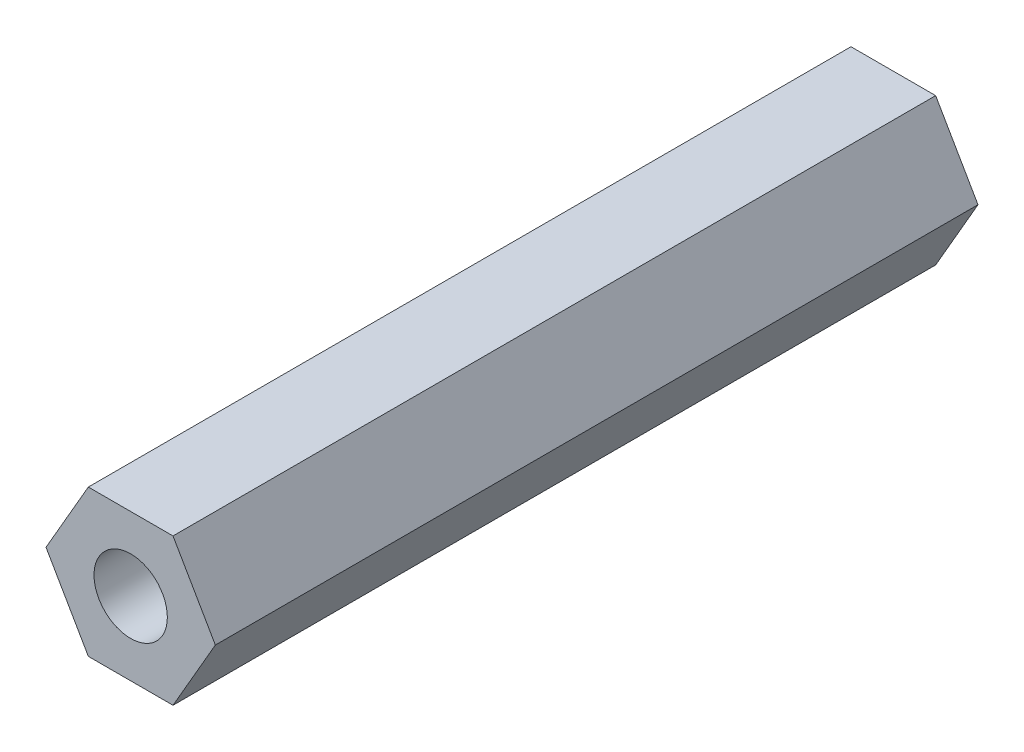
ISO-10303-21;
HEADER;
FILE_DESCRIPTION(('STEP AP214'),'2;1');
FILE_NAME('part.step','',(''),(''),'','','');
FILE_SCHEMA(('AUTOMOTIVE_DESIGN { 1 0 10303 214 1 1 1 1 }'));
ENDSEC;
DATA;
#1=APPLICATION_CONTEXT('core data for automotive mechanical design processes');
#2=APPLICATION_PROTOCOL_DEFINITION('international standard','automotive_design',2000,#1);
#3=PRODUCT_CONTEXT('',#1,'mechanical');
#4=PRODUCT('Part','Part','',(#3));
#5=PRODUCT_RELATED_PRODUCT_CATEGORY('part','',(#4));
#6=PRODUCT_DEFINITION_FORMATION('','',#4);
#7=PRODUCT_DEFINITION_CONTEXT('part definition',#1,'design');
#8=PRODUCT_DEFINITION('design','',#6,#7);
#9=PRODUCT_DEFINITION_SHAPE('','',#8);
#10=(LENGTH_UNIT() NAMED_UNIT(*) SI_UNIT(.MILLI.,.METRE.));
#11=(NAMED_UNIT(*) PLANE_ANGLE_UNIT() SI_UNIT($,.RADIAN.));
#12=(NAMED_UNIT(*) SI_UNIT($,.STERADIAN.) SOLID_ANGLE_UNIT());
#13=UNCERTAINTY_MEASURE_WITH_UNIT(LENGTH_MEASURE(1.E-05),#10,'distance_accuracy_value','');
#14=(GEOMETRIC_REPRESENTATION_CONTEXT(3) GLOBAL_UNCERTAINTY_ASSIGNED_CONTEXT((#13)) GLOBAL_UNIT_ASSIGNED_CONTEXT((#10,
#11,#12)) REPRESENTATION_CONTEXT('',''));
#15=CARTESIAN_POINT('',(0.,0.,0.));
#16=DIRECTION('',(0.,0.,1.));
#17=DIRECTION('',(1.,0.,0.));
#18=AXIS2_PLACEMENT_3D('',#15,#16,#17);
#19=CARTESIAN_POINT('',(0.,-2.5,26.));
#20=DIRECTION('',(0.,1.,0.));
#21=DIRECTION('',(-1.,0.,0.));
#22=AXIS2_PLACEMENT_3D('',#19,#20,#21);
#23=PLANE('',#22);
#24=DIRECTION('',(1.,0.,0.));
#25=VECTOR('',#24,1.);
#26=CARTESIAN_POINT('',(0.,-2.5,0.));
#27=LINE('',#26,#25);
#28=CARTESIAN_POINT('',(-1.44337567297404,-2.50000000000002,0.));
#29=VERTEX_POINT('',#28);
#30=CARTESIAN_POINT('',(1.44337567297409,-2.49999999999998,0.));
#31=VERTEX_POINT('',#30);
#32=EDGE_CURVE('E131',#29,#31,#27,.T.);
#33=ORIENTED_EDGE('',*,*,#32,.T.);
#34=DIRECTION('',(0.,0.,-1.));
#35=VECTOR('',#34,1.);
#36=CARTESIAN_POINT('',(1.44337567297409,-2.49999999999998,26.));
#37=LINE('',#36,#35);
#38=CARTESIAN_POINT('',(1.44337567297409,-2.49999999999998,26.));
#39=VERTEX_POINT('',#38);
#40=EDGE_CURVE('E11',#39,#31,#37,.T.);
#41=ORIENTED_EDGE('',*,*,#40,.F.);
#42=DIRECTION('',(1.,0.,0.));
#43=VECTOR('',#42,1.);
#44=CARTESIAN_POINT('',(0.,-2.5,26.));
#45=LINE('',#44,#43);
#46=CARTESIAN_POINT('',(-1.44337567297404,-2.50000000000002,26.));
#47=VERTEX_POINT('',#46);
#48=EDGE_CURVE('E142',#47,#39,#45,.T.);
#49=ORIENTED_EDGE('',*,*,#48,.F.);
#50=DIRECTION('',(0.,0.,-1.));
#51=VECTOR('',#50,1.);
#52=CARTESIAN_POINT('',(-1.44337567297404,-2.50000000000002,26.));
#53=LINE('',#52,#51);
#54=EDGE_CURVE('E127',#47,#29,#53,.T.);
#55=ORIENTED_EDGE('',*,*,#54,.T.);
#56=EDGE_LOOP('',(#33,#41,#49,#55));
#57=FACE_BOUND('',#56,.T.);
#58=ADVANCED_FACE('F45',(#57),#23,.F.);
#59=CARTESIAN_POINT('',(2.16506350946111,-1.24999999999999,26.));
#60=DIRECTION('',(-0.866025403784442,0.499999999999995,0.));
#61=DIRECTION('',(-0.499999999999995,-0.866025403784442,0.));
#62=AXIS2_PLACEMENT_3D('',#59,#60,#61);
#63=PLANE('',#62);
#64=DIRECTION('',(0.499999999999995,0.866025403784442,0.));
#65=VECTOR('',#64,1.);
#66=CARTESIAN_POINT('',(2.16506350946111,-1.24999999999999,0.));
#67=LINE('',#66,#65);
#68=CARTESIAN_POINT('',(2.88675134594813,0.,0.));
#69=VERTEX_POINT('',#68);
#70=EDGE_CURVE('E134',#31,#69,#67,.T.);
#71=ORIENTED_EDGE('',*,*,#70,.T.);
#72=DIRECTION('',(0.,0.,-1.));
#73=VECTOR('',#72,1.);
#74=CARTESIAN_POINT('',(2.88675134594813,0.,26.));
#75=LINE('',#74,#73);
#76=CARTESIAN_POINT('',(2.88675134594813,0.,26.));
#77=VERTEX_POINT('',#76);
#78=EDGE_CURVE('E53',#77,#69,#75,.T.);
#79=ORIENTED_EDGE('',*,*,#78,.F.);
#80=DIRECTION('',(0.499999999999995,0.866025403784442,0.));
#81=VECTOR('',#80,1.);
#82=CARTESIAN_POINT('',(2.16506350946111,-1.24999999999999,26.));
#83=LINE('',#82,#81);
#84=EDGE_CURVE('E99',#39,#77,#83,.T.);
#85=ORIENTED_EDGE('',*,*,#84,.F.);
#86=ORIENTED_EDGE('',*,*,#40,.T.);
#87=EDGE_LOOP('',(#71,#79,#85,#86));
#88=FACE_BOUND('',#87,.T.);
#89=ADVANCED_FACE('F167',(#88),#63,.F.);
#90=CARTESIAN_POINT('',(2.1650635094611,1.25,26.));
#91=DIRECTION('',(-0.866025403784438,-0.500000000000001,0.));
#92=DIRECTION('',(0.500000000000001,-0.866025403784438,0.));
#93=AXIS2_PLACEMENT_3D('',#90,#91,#92);
#94=PLANE('',#93);
#95=DIRECTION('',(-0.500000000000001,0.866025403784438,0.));
#96=VECTOR('',#95,1.);
#97=CARTESIAN_POINT('',(2.1650635094611,1.25,0.));
#98=LINE('',#97,#96);
#99=CARTESIAN_POINT('',(1.44337567297406,2.50000000000001,0.));
#100=VERTEX_POINT('',#99);
#101=EDGE_CURVE('E137',#69,#100,#98,.T.);
#102=ORIENTED_EDGE('',*,*,#101,.T.);
#103=DIRECTION('',(0.,0.,-1.));
#104=VECTOR('',#103,1.);
#105=CARTESIAN_POINT('',(1.44337567297406,2.50000000000001,26.));
#106=LINE('',#105,#104);
#107=CARTESIAN_POINT('',(1.44337567297406,2.50000000000001,26.));
#108=VERTEX_POINT('',#107);
#109=EDGE_CURVE('E122',#108,#100,#106,.T.);
#110=ORIENTED_EDGE('',*,*,#109,.F.);
#111=DIRECTION('',(-0.500000000000001,0.866025403784438,0.));
#112=VECTOR('',#111,1.);
#113=CARTESIAN_POINT('',(2.1650635094611,1.25,26.));
#114=LINE('',#113,#112);
#115=EDGE_CURVE('E113',#77,#108,#114,.T.);
#116=ORIENTED_EDGE('',*,*,#115,.F.);
#117=ORIENTED_EDGE('',*,*,#78,.T.);
#118=EDGE_LOOP('',(#102,#110,#116,#117));
#119=FACE_BOUND('',#118,.T.);
#120=ADVANCED_FACE('F148',(#119),#94,.F.);
#121=CARTESIAN_POINT('',(0.,2.5,26.));
#122=DIRECTION('',(0.,-1.,0.));
#123=DIRECTION('',(1.,0.,0.));
#124=AXIS2_PLACEMENT_3D('',#121,#122,#123);
#125=PLANE('',#124);
#126=DIRECTION('',(-1.,0.,0.));
#127=VECTOR('',#126,1.);
#128=CARTESIAN_POINT('',(0.,2.5,0.));
#129=LINE('',#128,#127);
#130=CARTESIAN_POINT('',(-1.44337567297408,2.49999999999999,0.));
#131=VERTEX_POINT('',#130);
#132=EDGE_CURVE('E121',#100,#131,#129,.T.);
#133=ORIENTED_EDGE('',*,*,#132,.T.);
#134=DIRECTION('',(0.,0.,-1.));
#135=VECTOR('',#134,1.);
#136=CARTESIAN_POINT('',(-1.44337567297408,2.49999999999999,26.));
#137=LINE('',#136,#135);
#138=CARTESIAN_POINT('',(-1.44337567297408,2.49999999999999,26.));
#139=VERTEX_POINT('',#138);
#140=EDGE_CURVE('E118',#139,#131,#137,.T.);
#141=ORIENTED_EDGE('',*,*,#140,.F.);
#142=DIRECTION('',(-1.,0.,0.));
#143=VECTOR('',#142,1.);
#144=CARTESIAN_POINT('',(0.,2.5,26.));
#145=LINE('',#144,#143);
#146=EDGE_CURVE('E107',#108,#139,#145,.T.);
#147=ORIENTED_EDGE('',*,*,#146,.F.);
#148=ORIENTED_EDGE('',*,*,#109,.T.);
#149=EDGE_LOOP('',(#133,#141,#147,#148));
#150=FACE_BOUND('',#149,.T.);
#151=ADVANCED_FACE('F119',(#150),#125,.F.);
#152=CARTESIAN_POINT('',(-2.1650635094611,1.24999999999999,26.));
#153=DIRECTION('',(0.866025403784441,-0.499999999999995,0.));
#154=DIRECTION('',(0.499999999999995,0.866025403784441,0.));
#155=AXIS2_PLACEMENT_3D('',#152,#153,#154);
#156=PLANE('',#155);
#157=DIRECTION('',(-0.499999999999995,-0.866025403784441,0.));
#158=VECTOR('',#157,1.);
#159=CARTESIAN_POINT('',(-2.1650635094611,1.24999999999999,0.));
#160=LINE('',#159,#158);
#161=CARTESIAN_POINT('',(-2.88675134594813,0.,0.));
#162=VERTEX_POINT('',#161);
#163=EDGE_CURVE('E85',#131,#162,#160,.T.);
#164=ORIENTED_EDGE('',*,*,#163,.T.);
#165=DIRECTION('',(0.,0.,-1.));
#166=VECTOR('',#165,1.);
#167=CARTESIAN_POINT('',(-2.88675134594813,0.,26.));
#168=LINE('',#167,#166);
#169=CARTESIAN_POINT('',(-2.88675134594813,0.,26.));
#170=VERTEX_POINT('',#169);
#171=EDGE_CURVE('E123',#170,#162,#168,.T.);
#172=ORIENTED_EDGE('',*,*,#171,.F.);
#173=DIRECTION('',(-0.499999999999995,-0.866025403784441,0.));
#174=VECTOR('',#173,1.);
#175=CARTESIAN_POINT('',(-2.1650635094611,1.24999999999999,26.));
#176=LINE('',#175,#174);
#177=EDGE_CURVE('E111',#139,#170,#176,.T.);
#178=ORIENTED_EDGE('',*,*,#177,.F.);
#179=ORIENTED_EDGE('',*,*,#140,.T.);
#180=EDGE_LOOP('',(#164,#172,#178,#179));
#181=FACE_BOUND('',#180,.T.);
#182=ADVANCED_FACE('F125',(#181),#156,.F.);
#183=CARTESIAN_POINT('',(-2.16506350946109,-1.25000000000002,26.));
#184=DIRECTION('',(0.866025403784434,0.500000000000007,0.));
#185=DIRECTION('',(-0.500000000000007,0.866025403784434,0.));
#186=AXIS2_PLACEMENT_3D('',#183,#184,#185);
#187=PLANE('',#186);
#188=DIRECTION('',(0.500000000000007,-0.866025403784435,0.));
#189=VECTOR('',#188,1.);
#190=CARTESIAN_POINT('',(-2.16506350946109,-1.25000000000002,0.));
#191=LINE('',#190,#189);
#192=EDGE_CURVE('E91',#162,#29,#191,.T.);
#193=ORIENTED_EDGE('',*,*,#192,.T.);
#194=ORIENTED_EDGE('',*,*,#54,.F.);
#195=DIRECTION('',(0.500000000000007,-0.866025403784435,0.));
#196=VECTOR('',#195,1.);
#197=CARTESIAN_POINT('',(-2.16506350946109,-1.25000000000002,26.));
#198=LINE('',#197,#196);
#199=EDGE_CURVE('E61',#170,#47,#198,.T.);
#200=ORIENTED_EDGE('',*,*,#199,.F.);
#201=ORIENTED_EDGE('',*,*,#171,.T.);
#202=EDGE_LOOP('',(#193,#194,#200,#201));
#203=FACE_BOUND('',#202,.T.);
#204=ADVANCED_FACE('F155',(#203),#187,.F.);
#205=CARTESIAN_POINT('',(0.,0.,26.));
#206=DIRECTION('',(0.,0.,1.));
#207=DIRECTION('',(1.,0.,0.));
#208=AXIS2_PLACEMENT_3D('',#205,#206,#207);
#209=PLANE('',#208);
#210=CARTESIAN_POINT('',(0.,0.,26.));
#211=DIRECTION('',(0.,0.,1.));
#212=DIRECTION('',(1.,0.,0.));
#213=AXIS2_PLACEMENT_3D('',#210,#211,#212);
#214=CIRCLE('',#213,1.25);
#215=CARTESIAN_POINT('',(1.25,0.,26.));
#216=VERTEX_POINT('',#215);
#217=EDGE_CURVE('E269',#216,#216,#214,.T.);
#218=ORIENTED_EDGE('',*,*,#217,.F.);
#219=EDGE_LOOP('',(#218));
#220=FACE_BOUND('',#219,.T.);
#221=ORIENTED_EDGE('',*,*,#48,.T.);
#222=ORIENTED_EDGE('',*,*,#84,.T.);
#223=ORIENTED_EDGE('',*,*,#115,.T.);
#224=ORIENTED_EDGE('',*,*,#146,.T.);
#225=ORIENTED_EDGE('',*,*,#177,.T.);
#226=ORIENTED_EDGE('',*,*,#199,.T.);
#227=EDGE_LOOP('',(#221,#222,#223,#224,#225,#226));
#228=FACE_BOUND('',#227,.T.);
#229=ADVANCED_FACE('F109',(#220,#228),#209,.T.);
#230=CARTESIAN_POINT('',(0.,0.,0.));
#231=DIRECTION('',(0.,0.,1.));
#232=DIRECTION('',(1.,0.,0.));
#233=AXIS2_PLACEMENT_3D('',#230,#231,#232);
#234=PLANE('',#233);
#235=ORIENTED_EDGE('',*,*,#32,.F.);
#236=ORIENTED_EDGE('',*,*,#192,.F.);
#237=ORIENTED_EDGE('',*,*,#163,.F.);
#238=ORIENTED_EDGE('',*,*,#132,.F.);
#239=ORIENTED_EDGE('',*,*,#101,.F.);
#240=ORIENTED_EDGE('',*,*,#70,.F.);
#241=EDGE_LOOP('',(#235,#236,#237,#238,#239,#240));
#242=FACE_BOUND('',#241,.T.);
#243=ADVANCED_FACE('F151',(#242),#234,.F.);
#244=CARTESIAN_POINT('',(0.,0.,18.5));
#245=DIRECTION('',(0.,0.,1.));
#246=DIRECTION('',(1.,0.,0.));
#247=AXIS2_PLACEMENT_3D('',#244,#245,#246);
#248=CONICAL_SURFACE('',#247,1.25,1.02974425867665);
#249=CARTESIAN_POINT('',(0.,0.,17.7489242262155));
#250=VERTEX_POINT('',#249);
#251=VERTEX_LOOP('',#250);
#252=FACE_BOUND('',#251,.T.);
#253=CARTESIAN_POINT('',(0.,0.,18.5));
#254=DIRECTION('',(0.,0.,1.));
#255=DIRECTION('',(1.,0.,0.));
#256=AXIS2_PLACEMENT_3D('',#253,#254,#255);
#257=CIRCLE('',#256,1.25);
#258=CARTESIAN_POINT('',(1.25,0.,18.5));
#259=VERTEX_POINT('',#258);
#260=EDGE_CURVE('E135',#259,#259,#257,.T.);
#261=ORIENTED_EDGE('',*,*,#260,.T.);
#262=EDGE_LOOP('',(#261));
#263=FACE_BOUND('',#262,.T.);
#264=ADVANCED_FACE('F201',(#252,#263),#248,.F.);
#265=CARTESIAN_POINT('',(0.,0.,26.));
#266=DIRECTION('',(0.,0.,1.));
#267=DIRECTION('',(1.,0.,0.));
#268=AXIS2_PLACEMENT_3D('',#265,#266,#267);
#269=CYLINDRICAL_SURFACE('',#268,1.25);
#270=ORIENTED_EDGE('',*,*,#260,.F.);
#271=EDGE_LOOP('',(#270));
#272=FACE_BOUND('',#271,.T.);
#273=ORIENTED_EDGE('',*,*,#217,.T.);
#274=EDGE_LOOP('',(#273));
#275=FACE_BOUND('',#274,.T.);
#276=ADVANCED_FACE('F216',(#272,#275),#269,.F.);
#277=CLOSED_SHELL('',(#58,#89,#120,#151,#182,#204,#229,#243,#264,#276));
#278=MANIFOLD_SOLID_BREP('B2',#277);
#279=ADVANCED_BREP_SHAPE_REPRESENTATION('',(#18,#278),#14);
#280=SHAPE_DEFINITION_REPRESENTATION(#9,#279);
ENDSEC;
END-ISO-10303-21;
